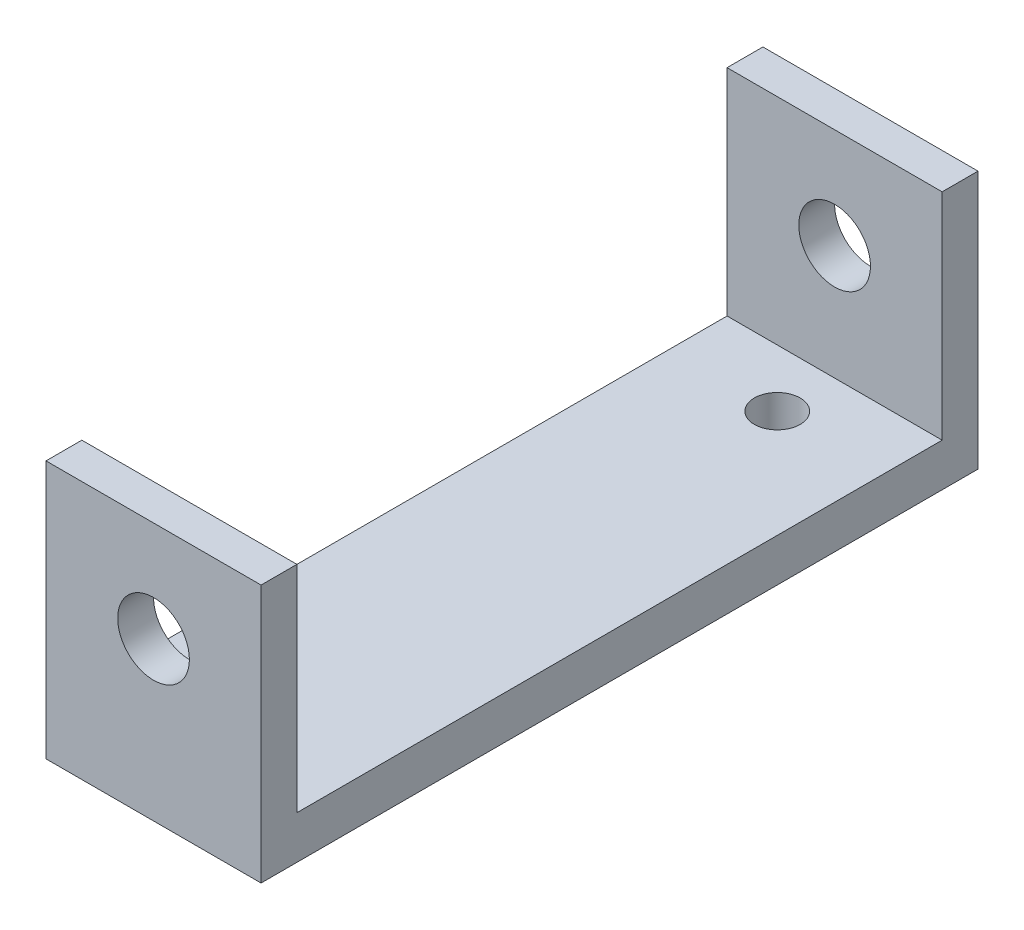
ISO-10303-21;
HEADER;
FILE_DESCRIPTION(('STEP AP214'),'2;1');
FILE_NAME('part.step','',(''),(''),'','','');
FILE_SCHEMA(('AUTOMOTIVE_DESIGN { 1 0 10303 214 1 1 1 1 }'));
ENDSEC;
DATA;
#1=APPLICATION_CONTEXT('core data for automotive mechanical design processes');
#2=APPLICATION_PROTOCOL_DEFINITION('international standard','automotive_design',2000,#1);
#3=PRODUCT_CONTEXT('',#1,'mechanical');
#4=PRODUCT('Part','Part','',(#3));
#5=PRODUCT_RELATED_PRODUCT_CATEGORY('part','',(#4));
#6=PRODUCT_DEFINITION_FORMATION('','',#4);
#7=PRODUCT_DEFINITION_CONTEXT('part definition',#1,'design');
#8=PRODUCT_DEFINITION('design','',#6,#7);
#9=PRODUCT_DEFINITION_SHAPE('','',#8);
#10=(LENGTH_UNIT() NAMED_UNIT(*) SI_UNIT(.MILLI.,.METRE.));
#11=(NAMED_UNIT(*) PLANE_ANGLE_UNIT() SI_UNIT($,.RADIAN.));
#12=(NAMED_UNIT(*) SI_UNIT($,.STERADIAN.) SOLID_ANGLE_UNIT());
#13=UNCERTAINTY_MEASURE_WITH_UNIT(LENGTH_MEASURE(1.E-05),#10,'distance_accuracy_value','');
#14=(GEOMETRIC_REPRESENTATION_CONTEXT(3) GLOBAL_UNCERTAINTY_ASSIGNED_CONTEXT((#13)) GLOBAL_UNIT_ASSIGNED_CONTEXT((#10,
#11,#12)) REPRESENTATION_CONTEXT('',''));
#15=CARTESIAN_POINT('',(0.,0.,0.));
#16=DIRECTION('',(0.,0.,1.));
#17=DIRECTION('',(1.,0.,0.));
#18=AXIS2_PLACEMENT_3D('',#15,#16,#17);
#19=CARTESIAN_POINT('',(-124.377940305885,32.2359859970464,50.));
#20=DIRECTION('',(0.,-1.,0.));
#21=DIRECTION('',(0.,0.,-1.));
#22=AXIS2_PLACEMENT_3D('',#19,#20,#21);
#23=PLANE('',#22);
#24=CARTESIAN_POINT('',(-116.877940305885,32.2359859970464,43.5));
#25=DIRECTION('',(0.,1.,0.));
#26=DIRECTION('',(0.,0.,1.));
#27=AXIS2_PLACEMENT_3D('',#24,#25,#26);
#28=CIRCLE('',#27,1.60000000000001);
#29=CARTESIAN_POINT('',(-116.877940305885,32.2359859970464,45.1));
#30=VERTEX_POINT('',#29);
#31=EDGE_CURVE('E154',#30,#30,#28,.T.);
#32=ORIENTED_EDGE('',*,*,#31,.F.);
#33=EDGE_LOOP('',(#32));
#34=FACE_BOUND('',#33,.T.);
#35=CARTESIAN_POINT('',(-116.877940305885,32.2359859970464,6.50000000000001));
#36=DIRECTION('',(0.,1.,0.));
#37=DIRECTION('',(0.,0.,-1.));
#38=AXIS2_PLACEMENT_3D('',#35,#36,#37);
#39=CIRCLE('',#38,1.60000000000001);
#40=CARTESIAN_POINT('',(-116.877940305885,32.2359859970464,8.10000000000001));
#41=VERTEX_POINT('',#40);
#42=EDGE_CURVE('E153',#41,#41,#39,.T.);
#43=ORIENTED_EDGE('',*,*,#42,.F.);
#44=EDGE_LOOP('',(#43));
#45=FACE_BOUND('',#44,.T.);
#46=DIRECTION('',(1.,0.,0.));
#47=VECTOR('',#46,1.);
#48=CARTESIAN_POINT('',(-109.377940305885,32.2359859970464,2.5));
#49=LINE('',#48,#47);
#50=CARTESIAN_POINT('',(-124.377940305885,32.2359859970464,2.5));
#51=VERTEX_POINT('',#50);
#52=CARTESIAN_POINT('',(-109.377940305885,32.2359859970464,2.5));
#53=VERTEX_POINT('',#52);
#54=EDGE_CURVE('E51',#51,#53,#49,.T.);
#55=ORIENTED_EDGE('',*,*,#54,.F.);
#56=DIRECTION('',(0.,0.,-1.));
#57=VECTOR('',#56,1.);
#58=CARTESIAN_POINT('',(-124.377940305885,32.2359859970464,50.));
#59=LINE('',#58,#57);
#60=CARTESIAN_POINT('',(-124.377940305885,32.2359859970464,47.5));
#61=VERTEX_POINT('',#60);
#62=EDGE_CURVE('E41',#61,#51,#59,.T.);
#63=ORIENTED_EDGE('',*,*,#62,.F.);
#64=DIRECTION('',(-1.,0.,0.));
#65=VECTOR('',#64,1.);
#66=CARTESIAN_POINT('',(-109.377940305885,32.2359859970464,47.5));
#67=LINE('',#66,#65);
#68=CARTESIAN_POINT('',(-109.377940305885,32.2359859970464,47.5));
#69=VERTEX_POINT('',#68);
#70=EDGE_CURVE('E133',#69,#61,#67,.T.);
#71=ORIENTED_EDGE('',*,*,#70,.F.);
#72=DIRECTION('',(0.,0.,-1.));
#73=VECTOR('',#72,1.);
#74=CARTESIAN_POINT('',(-109.377940305885,32.2359859970464,50.));
#75=LINE('',#74,#73);
#76=EDGE_CURVE('E11',#69,#53,#75,.T.);
#77=ORIENTED_EDGE('',*,*,#76,.T.);
#78=EDGE_LOOP('',(#55,#63,#71,#77));
#79=FACE_BOUND('',#78,.T.);
#80=ADVANCED_FACE('F32',(#34,#45,#79),#23,.F.);
#81=CARTESIAN_POINT('',(-109.377940305885,32.2359859970464,50.));
#82=DIRECTION('',(-1.,0.,0.));
#83=DIRECTION('',(0.,0.,1.));
#84=AXIS2_PLACEMENT_3D('',#81,#82,#83);
#85=PLANE('',#84);
#86=DIRECTION('',(0.,1.,0.));
#87=VECTOR('',#86,1.);
#88=CARTESIAN_POINT('',(-109.377940305885,32.2359859970464,0.));
#89=LINE('',#88,#87);
#90=CARTESIAN_POINT('',(-109.377940305885,29.2359859970464,0.));
#91=VERTEX_POINT('',#90);
#92=CARTESIAN_POINT('',(-109.377940305885,47.2359859970464,0.));
#93=VERTEX_POINT('',#92);
#94=EDGE_CURVE('E96',#91,#93,#89,.T.);
#95=ORIENTED_EDGE('',*,*,#94,.T.);
#96=DIRECTION('',(0.,0.,-1.));
#97=VECTOR('',#96,1.);
#98=CARTESIAN_POINT('',(-109.377940305885,47.2359859970464,0.));
#99=LINE('',#98,#97);
#100=CARTESIAN_POINT('',(-109.377940305885,47.2359859970464,2.5));
#101=VERTEX_POINT('',#100);
#102=EDGE_CURVE('E100',#101,#93,#99,.T.);
#103=ORIENTED_EDGE('',*,*,#102,.F.);
#104=DIRECTION('',(0.,-1.,0.));
#105=VECTOR('',#104,1.);
#106=CARTESIAN_POINT('',(-109.377940305885,47.2359859970464,2.5));
#107=LINE('',#106,#105);
#108=EDGE_CURVE('E127',#101,#53,#107,.T.);
#109=ORIENTED_EDGE('',*,*,#108,.T.);
#110=ORIENTED_EDGE('',*,*,#76,.F.);
#111=DIRECTION('',(0.,-1.,0.));
#112=VECTOR('',#111,1.);
#113=CARTESIAN_POINT('',(-109.377940305885,47.2359859970464,47.5));
#114=LINE('',#113,#112);
#115=CARTESIAN_POINT('',(-109.377940305885,47.2359859970464,47.5));
#116=VERTEX_POINT('',#115);
#117=EDGE_CURVE('E150',#116,#69,#114,.T.);
#118=ORIENTED_EDGE('',*,*,#117,.F.);
#119=DIRECTION('',(0.,0.,-1.));
#120=VECTOR('',#119,1.);
#121=CARTESIAN_POINT('',(-109.377940305885,47.2359859970464,50.));
#122=LINE('',#121,#120);
#123=CARTESIAN_POINT('',(-109.377940305885,47.2359859970464,50.));
#124=VERTEX_POINT('',#123);
#125=EDGE_CURVE('E134',#124,#116,#122,.T.);
#126=ORIENTED_EDGE('',*,*,#125,.F.);
#127=DIRECTION('',(0.,1.,0.));
#128=VECTOR('',#127,1.);
#129=CARTESIAN_POINT('',(-109.377940305885,32.2359859970464,50.));
#130=LINE('',#129,#128);
#131=CARTESIAN_POINT('',(-109.377940305885,29.2359859970464,50.));
#132=VERTEX_POINT('',#131);
#133=EDGE_CURVE('E160',#132,#124,#130,.T.);
#134=ORIENTED_EDGE('',*,*,#133,.F.);
#135=DIRECTION('',(0.,0.,-1.));
#136=VECTOR('',#135,1.);
#137=CARTESIAN_POINT('',(-109.377940305885,29.2359859970464,50.));
#138=LINE('',#137,#136);
#139=EDGE_CURVE('E103',#132,#91,#138,.T.);
#140=ORIENTED_EDGE('',*,*,#139,.T.);
#141=EDGE_LOOP('',(#95,#103,#109,#110,#118,#126,#134,#140));
#142=FACE_BOUND('',#141,.T.);
#143=ADVANCED_FACE('F34',(#142),#85,.F.);
#144=CARTESIAN_POINT('',(-124.377940305885,32.2359859970464,50.));
#145=DIRECTION('',(1.,0.,0.));
#146=DIRECTION('',(0.,0.,-1.));
#147=AXIS2_PLACEMENT_3D('',#144,#145,#146);
#148=PLANE('',#147);
#149=DIRECTION('',(0.,-1.,0.));
#150=VECTOR('',#149,1.);
#151=CARTESIAN_POINT('',(-124.377940305885,32.2359859970464,0.));
#152=LINE('',#151,#150);
#153=CARTESIAN_POINT('',(-124.377940305885,47.2359859970464,0.));
#154=VERTEX_POINT('',#153);
#155=CARTESIAN_POINT('',(-124.377940305885,29.2359859970464,0.));
#156=VERTEX_POINT('',#155);
#157=EDGE_CURVE('E106',#154,#156,#152,.T.);
#158=ORIENTED_EDGE('',*,*,#157,.T.);
#159=DIRECTION('',(0.,0.,-1.));
#160=VECTOR('',#159,1.);
#161=CARTESIAN_POINT('',(-124.377940305885,29.2359859970464,50.));
#162=LINE('',#161,#160);
#163=CARTESIAN_POINT('',(-124.377940305885,29.2359859970464,50.));
#164=VERTEX_POINT('',#163);
#165=EDGE_CURVE('E170',#164,#156,#162,.T.);
#166=ORIENTED_EDGE('',*,*,#165,.F.);
#167=DIRECTION('',(0.,-1.,0.));
#168=VECTOR('',#167,1.);
#169=CARTESIAN_POINT('',(-124.377940305885,32.2359859970464,50.));
#170=LINE('',#169,#168);
#171=CARTESIAN_POINT('',(-124.377940305885,47.2359859970464,50.));
#172=VERTEX_POINT('',#171);
#173=EDGE_CURVE('E162',#172,#164,#170,.T.);
#174=ORIENTED_EDGE('',*,*,#173,.F.);
#175=DIRECTION('',(0.,0.,1.));
#176=VECTOR('',#175,1.);
#177=CARTESIAN_POINT('',(-124.377940305885,47.2359859970464,50.));
#178=LINE('',#177,#176);
#179=CARTESIAN_POINT('',(-124.377940305885,47.2359859970464,47.5));
#180=VERTEX_POINT('',#179);
#181=EDGE_CURVE('E139',#180,#172,#178,.T.);
#182=ORIENTED_EDGE('',*,*,#181,.F.);
#183=DIRECTION('',(0.,-1.,0.));
#184=VECTOR('',#183,1.);
#185=CARTESIAN_POINT('',(-124.377940305885,47.2359859970464,47.5));
#186=LINE('',#185,#184);
#187=EDGE_CURVE('E145',#180,#61,#186,.T.);
#188=ORIENTED_EDGE('',*,*,#187,.T.);
#189=ORIENTED_EDGE('',*,*,#62,.T.);
#190=DIRECTION('',(0.,-1.,0.));
#191=VECTOR('',#190,1.);
#192=CARTESIAN_POINT('',(-124.377940305885,47.2359859970464,2.5));
#193=LINE('',#192,#191);
#194=CARTESIAN_POINT('',(-124.377940305885,47.2359859970464,2.5));
#195=VERTEX_POINT('',#194);
#196=EDGE_CURVE('E130',#195,#51,#193,.T.);
#197=ORIENTED_EDGE('',*,*,#196,.F.);
#198=DIRECTION('',(0.,0.,1.));
#199=VECTOR('',#198,1.);
#200=CARTESIAN_POINT('',(-124.377940305885,47.2359859970464,0.));
#201=LINE('',#200,#199);
#202=EDGE_CURVE('E114',#154,#195,#201,.T.);
#203=ORIENTED_EDGE('',*,*,#202,.F.);
#204=EDGE_LOOP('',(#158,#166,#174,#182,#188,#189,#197,#203));
#205=FACE_BOUND('',#204,.T.);
#206=ADVANCED_FACE('F201',(#205),#148,.F.);
#207=CARTESIAN_POINT('',(-124.377940305885,29.2359859970464,50.));
#208=DIRECTION('',(0.,1.,0.));
#209=DIRECTION('',(0.,0.,1.));
#210=AXIS2_PLACEMENT_3D('',#207,#208,#209);
#211=PLANE('',#210);
#212=CARTESIAN_POINT('',(-116.877940305885,29.2359859970464,43.5));
#213=DIRECTION('',(0.,1.,0.));
#214=DIRECTION('',(0.,0.,1.));
#215=AXIS2_PLACEMENT_3D('',#212,#213,#214);
#216=CIRCLE('',#215,1.60000000000001);
#217=CARTESIAN_POINT('',(-116.877940305885,29.2359859970464,45.1));
#218=VERTEX_POINT('',#217);
#219=EDGE_CURVE('E107',#218,#218,#216,.T.);
#220=ORIENTED_EDGE('',*,*,#219,.T.);
#221=EDGE_LOOP('',(#220));
#222=FACE_BOUND('',#221,.T.);
#223=CARTESIAN_POINT('',(-116.877940305885,29.2359859970464,6.50000000000001));
#224=DIRECTION('',(0.,1.,0.));
#225=DIRECTION('',(0.,0.,1.));
#226=AXIS2_PLACEMENT_3D('',#223,#224,#225);
#227=CIRCLE('',#226,1.60000000000001);
#228=CARTESIAN_POINT('',(-116.877940305885,29.2359859970464,8.10000000000001));
#229=VERTEX_POINT('',#228);
#230=EDGE_CURVE('E157',#229,#229,#227,.T.);
#231=ORIENTED_EDGE('',*,*,#230,.T.);
#232=EDGE_LOOP('',(#231));
#233=FACE_BOUND('',#232,.T.);
#234=DIRECTION('',(1.,0.,0.));
#235=VECTOR('',#234,1.);
#236=CARTESIAN_POINT('',(-124.377940305885,29.2359859970464,0.));
#237=LINE('',#236,#235);
#238=EDGE_CURVE('E163',#156,#91,#237,.T.);
#239=ORIENTED_EDGE('',*,*,#238,.T.);
#240=ORIENTED_EDGE('',*,*,#139,.F.);
#241=DIRECTION('',(1.,0.,0.));
#242=VECTOR('',#241,1.);
#243=CARTESIAN_POINT('',(-124.377940305885,29.2359859970464,50.));
#244=LINE('',#243,#242);
#245=EDGE_CURVE('E165',#164,#132,#244,.T.);
#246=ORIENTED_EDGE('',*,*,#245,.F.);
#247=ORIENTED_EDGE('',*,*,#165,.T.);
#248=EDGE_LOOP('',(#239,#240,#246,#247));
#249=FACE_BOUND('',#248,.T.);
#250=ADVANCED_FACE('F178',(#222,#233,#249),#211,.F.);
#251=CARTESIAN_POINT('',(0.,0.,50.));
#252=DIRECTION('',(0.,0.,1.));
#253=DIRECTION('',(1.,0.,0.));
#254=AXIS2_PLACEMENT_3D('',#251,#252,#253);
#255=PLANE('',#254);
#256=CARTESIAN_POINT('',(-116.877940305885,40.2359859970464,50.));
#257=DIRECTION('',(0.,0.,1.));
#258=DIRECTION('',(1.,0.,0.));
#259=AXIS2_PLACEMENT_3D('',#256,#257,#258);
#260=CIRCLE('',#259,2.5);
#261=CARTESIAN_POINT('',(-114.377940305885,40.2359859970464,50.));
#262=VERTEX_POINT('',#261);
#263=EDGE_CURVE('E221',#262,#262,#260,.T.);
#264=ORIENTED_EDGE('',*,*,#263,.F.);
#265=EDGE_LOOP('',(#264));
#266=FACE_BOUND('',#265,.T.);
#267=ORIENTED_EDGE('',*,*,#133,.T.);
#268=DIRECTION('',(1.,0.,0.));
#269=VECTOR('',#268,1.);
#270=CARTESIAN_POINT('',(-109.377940305885,47.2359859970464,50.));
#271=LINE('',#270,#269);
#272=EDGE_CURVE('E142',#172,#124,#271,.T.);
#273=ORIENTED_EDGE('',*,*,#272,.F.);
#274=ORIENTED_EDGE('',*,*,#173,.T.);
#275=ORIENTED_EDGE('',*,*,#245,.T.);
#276=EDGE_LOOP('',(#267,#273,#274,#275));
#277=FACE_BOUND('',#276,.T.);
#278=ADVANCED_FACE('F210',(#266,#277),#255,.T.);
#279=CARTESIAN_POINT('',(0.,0.,0.));
#280=DIRECTION('',(0.,0.,1.));
#281=DIRECTION('',(1.,0.,0.));
#282=AXIS2_PLACEMENT_3D('',#279,#280,#281);
#283=PLANE('',#282);
#284=CARTESIAN_POINT('',(-116.877940305885,40.2359859970464,0.));
#285=DIRECTION('',(0.,0.,1.));
#286=DIRECTION('',(1.,0.,0.));
#287=AXIS2_PLACEMENT_3D('',#284,#285,#286);
#288=CIRCLE('',#287,2.5);
#289=CARTESIAN_POINT('',(-114.377940305885,40.2359859970464,0.));
#290=VERTEX_POINT('',#289);
#291=EDGE_CURVE('E121',#290,#290,#288,.T.);
#292=ORIENTED_EDGE('',*,*,#291,.T.);
#293=EDGE_LOOP('',(#292));
#294=FACE_BOUND('',#293,.T.);
#295=ORIENTED_EDGE('',*,*,#94,.F.);
#296=ORIENTED_EDGE('',*,*,#238,.F.);
#297=ORIENTED_EDGE('',*,*,#157,.F.);
#298=DIRECTION('',(-1.,0.,0.));
#299=VECTOR('',#298,1.);
#300=CARTESIAN_POINT('',(-109.377940305885,47.2359859970464,0.));
#301=LINE('',#300,#299);
#302=EDGE_CURVE('E110',#93,#154,#301,.T.);
#303=ORIENTED_EDGE('',*,*,#302,.F.);
#304=EDGE_LOOP('',(#295,#296,#297,#303));
#305=FACE_BOUND('',#304,.T.);
#306=ADVANCED_FACE('F111',(#294,#305),#283,.F.);
#307=CARTESIAN_POINT('',(-116.877940305885,-12.7640140029536,6.50000000000001));
#308=DIRECTION('',(0.,1.,0.));
#309=DIRECTION('',(0.,0.,1.));
#310=AXIS2_PLACEMENT_3D('',#307,#308,#309);
#311=CYLINDRICAL_SURFACE('',#310,1.60000000000001);
#312=CARTESIAN_POINT('',(-116.877940305885,32.2359859970464,8.10000000000001));
#313=CARTESIAN_POINT('',(-116.877940305885,32.2047359970464,8.10000000000001));
#314=CARTESIAN_POINT('',(-116.877940305885,32.1734859970464,8.10000000000001));
#315=CARTESIAN_POINT('',(-116.877940305885,32.1109859970464,8.10000000000001));
#316=CARTESIAN_POINT('',(-116.877940305885,32.0797359970464,8.10000000000001));
#317=CARTESIAN_POINT('',(-116.877940305885,32.0172359970464,8.10000000000001));
#318=CARTESIAN_POINT('',(-116.877940305885,31.9859859970464,8.10000000000001));
#319=CARTESIAN_POINT('',(-116.877940305885,31.9234859970464,8.10000000000001));
#320=CARTESIAN_POINT('',(-116.877940305885,31.8922359970464,8.10000000000001));
#321=CARTESIAN_POINT('',(-116.877940305885,31.8297359970464,8.10000000000001));
#322=CARTESIAN_POINT('',(-116.877940305885,31.7984859970464,8.10000000000001));
#323=CARTESIAN_POINT('',(-116.877940305885,31.7359859970464,8.10000000000001));
#324=CARTESIAN_POINT('',(-116.877940305885,31.7047359970464,8.10000000000001));
#325=CARTESIAN_POINT('',(-116.877940305885,31.6422359970464,8.10000000000001));
#326=CARTESIAN_POINT('',(-116.877940305885,31.6109859970464,8.10000000000001));
#327=CARTESIAN_POINT('',(-116.877940305885,31.5484859970464,8.10000000000001));
#328=CARTESIAN_POINT('',(-116.877940305885,31.5172359970464,8.10000000000001));
#329=CARTESIAN_POINT('',(-116.877940305885,31.4547359970464,8.10000000000001));
#330=CARTESIAN_POINT('',(-116.877940305885,31.4234859970464,8.10000000000001));
#331=CARTESIAN_POINT('',(-116.877940305885,31.3609859970464,8.10000000000001));
#332=CARTESIAN_POINT('',(-116.877940305885,31.3297359970464,8.10000000000001));
#333=CARTESIAN_POINT('',(-116.877940305885,31.2672359970464,8.10000000000001));
#334=CARTESIAN_POINT('',(-116.877940305885,31.2359859970464,8.10000000000001));
#335=CARTESIAN_POINT('',(-116.877940305885,31.1734859970464,8.10000000000001));
#336=CARTESIAN_POINT('',(-116.877940305885,31.1422359970464,8.10000000000001));
#337=CARTESIAN_POINT('',(-116.877940305885,31.0797359970464,8.10000000000001));
#338=CARTESIAN_POINT('',(-116.877940305885,31.0484859970464,8.10000000000001));
#339=CARTESIAN_POINT('',(-116.877940305885,30.9859859970464,8.10000000000001));
#340=CARTESIAN_POINT('',(-116.877940305885,30.9547359970464,8.10000000000001));
#341=CARTESIAN_POINT('',(-116.877940305885,30.8922359970464,8.10000000000001));
#342=CARTESIAN_POINT('',(-116.877940305885,30.8609859970464,8.10000000000001));
#343=CARTESIAN_POINT('',(-116.877940305885,30.7984859970464,8.10000000000001));
#344=CARTESIAN_POINT('',(-116.877940305885,30.7672359970464,8.10000000000001));
#345=CARTESIAN_POINT('',(-116.877940305885,30.7047359970464,8.10000000000001));
#346=CARTESIAN_POINT('',(-116.877940305885,30.6734859970464,8.10000000000001));
#347=CARTESIAN_POINT('',(-116.877940305885,30.6109859970464,8.10000000000001));
#348=CARTESIAN_POINT('',(-116.877940305885,30.5797359970464,8.10000000000001));
#349=CARTESIAN_POINT('',(-116.877940305885,30.5172359970464,8.10000000000001));
#350=CARTESIAN_POINT('',(-116.877940305885,30.4859859970464,8.10000000000001));
#351=CARTESIAN_POINT('',(-116.877940305885,30.4234859970464,8.10000000000001));
#352=CARTESIAN_POINT('',(-116.877940305885,30.3922359970464,8.10000000000001));
#353=CARTESIAN_POINT('',(-116.877940305885,30.3297359970464,8.10000000000001));
#354=CARTESIAN_POINT('',(-116.877940305885,30.2984859970464,8.10000000000001));
#355=CARTESIAN_POINT('',(-116.877940305885,30.2359859970464,8.10000000000001));
#356=CARTESIAN_POINT('',(-116.877940305885,30.2047359970464,8.10000000000001));
#357=CARTESIAN_POINT('',(-116.877940305885,30.1422359970464,8.10000000000001));
#358=CARTESIAN_POINT('',(-116.877940305885,30.1109859970464,8.10000000000001));
#359=CARTESIAN_POINT('',(-116.877940305885,30.0484859970464,8.10000000000001));
#360=CARTESIAN_POINT('',(-116.877940305885,30.0172359970464,8.10000000000001));
#361=CARTESIAN_POINT('',(-116.877940305885,29.9547359970464,8.10000000000001));
#362=CARTESIAN_POINT('',(-116.877940305885,29.9234859970464,8.10000000000001));
#363=CARTESIAN_POINT('',(-116.877940305885,29.8609859970464,8.10000000000001));
#364=CARTESIAN_POINT('',(-116.877940305885,29.8297359970464,8.10000000000001));
#365=CARTESIAN_POINT('',(-116.877940305885,29.7672359970464,8.10000000000001));
#366=CARTESIAN_POINT('',(-116.877940305885,29.7359859970464,8.10000000000001));
#367=CARTESIAN_POINT('',(-116.877940305885,29.6734859970464,8.10000000000001));
#368=CARTESIAN_POINT('',(-116.877940305885,29.6422359970464,8.10000000000001));
#369=CARTESIAN_POINT('',(-116.877940305885,29.5797359970464,8.10000000000001));
#370=CARTESIAN_POINT('',(-116.877940305885,29.5484859970464,8.10000000000001));
#371=CARTESIAN_POINT('',(-116.877940305885,29.4859859970464,8.10000000000001));
#372=CARTESIAN_POINT('',(-116.877940305885,29.4547359970464,8.10000000000001));
#373=CARTESIAN_POINT('',(-116.877940305885,29.3922359970464,8.10000000000001));
#374=CARTESIAN_POINT('',(-116.877940305885,29.3609859970464,8.10000000000001));
#375=CARTESIAN_POINT('',(-116.877940305885,29.2984859970464,8.10000000000001));
#376=CARTESIAN_POINT('',(-116.877940305885,29.2672359970464,8.10000000000001));
#377=CARTESIAN_POINT('',(-116.877940305885,29.2359859970464,8.10000000000001));
#378=B_SPLINE_CURVE_WITH_KNOTS('',3,(#312,#313,#314,#315,#316,#317,#318,#319,#320,#321,#322,
#323,#324,#325,#326,#327,#328,#329,#330,#331,#332,#333,#334,#335,#336,#337,#338,#339,#340,#341,
#342,#343,#344,#345,#346,#347,#348,#349,#350,#351,#352,#353,#354,#355,#356,#357,#358,#359,#360,
#361,#362,#363,#364,#365,#366,#367,#368,#369,#370,#371,#372,#373,#374,#375,#376,#377),
.UNSPECIFIED.,.F.,.F.,(4,2,2,2,2,2,2,2,2,2,2,2,2,2,2,2,2,2,2,2,2,2,2,2,2,2,2,2,2,2,2,2,4),(0.,
0.0937500000000036,0.1875,0.281249999999997,0.375,0.468750000000004,0.5625,0.656249999999997,
0.750000000000001,0.843750000000004,0.937500000000001,1.03125,1.125,1.21875,1.3125,1.40625,1.5,
1.59375,1.6875,1.78125,1.875,1.96875000000001,2.0625,2.15625,2.25,2.34375000000001,2.4375,
2.53125,2.625,2.71875000000001,2.8125,2.90625,3.),.UNSPECIFIED.);
#379=EDGE_CURVE('BSEAM184',#41,#229,#378,.T.);
#380=ORIENTED_EDGE('',*,*,#42,.T.);
#381=ORIENTED_EDGE('',*,*,#230,.F.);
#382=ORIENTED_EDGE('',*,*,#379,.T.);
#383=ORIENTED_EDGE('',*,*,#379,.F.);
#384=EDGE_LOOP('',(#380,#382,#381,#383));
#385=FACE_BOUND('',#384,.T.);
#386=ADVANCED_FACE('F184',(#385),#311,.F.);
#387=CARTESIAN_POINT('',(-116.877940305885,-12.7640140029536,43.5));
#388=DIRECTION('',(0.,1.,0.));
#389=DIRECTION('',(0.,0.,1.));
#390=AXIS2_PLACEMENT_3D('',#387,#388,#389);
#391=CYLINDRICAL_SURFACE('',#390,1.60000000000001);
#392=CARTESIAN_POINT('',(-116.877940305885,32.2359859970464,45.1));
#393=CARTESIAN_POINT('',(-116.877940305885,32.2047359970464,45.1));
#394=CARTESIAN_POINT('',(-116.877940305885,32.1734859970464,45.1));
#395=CARTESIAN_POINT('',(-116.877940305885,32.1109859970464,45.1));
#396=CARTESIAN_POINT('',(-116.877940305885,32.0797359970464,45.1));
#397=CARTESIAN_POINT('',(-116.877940305885,32.0172359970464,45.1));
#398=CARTESIAN_POINT('',(-116.877940305885,31.9859859970464,45.1));
#399=CARTESIAN_POINT('',(-116.877940305885,31.9234859970464,45.1));
#400=CARTESIAN_POINT('',(-116.877940305885,31.8922359970464,45.1));
#401=CARTESIAN_POINT('',(-116.877940305885,31.8297359970464,45.1));
#402=CARTESIAN_POINT('',(-116.877940305885,31.7984859970464,45.1));
#403=CARTESIAN_POINT('',(-116.877940305885,31.7359859970464,45.1));
#404=CARTESIAN_POINT('',(-116.877940305885,31.7047359970464,45.1));
#405=CARTESIAN_POINT('',(-116.877940305885,31.6422359970464,45.1));
#406=CARTESIAN_POINT('',(-116.877940305885,31.6109859970464,45.1));
#407=CARTESIAN_POINT('',(-116.877940305885,31.5484859970464,45.1));
#408=CARTESIAN_POINT('',(-116.877940305885,31.5172359970464,45.1));
#409=CARTESIAN_POINT('',(-116.877940305885,31.4547359970464,45.1));
#410=CARTESIAN_POINT('',(-116.877940305885,31.4234859970464,45.1));
#411=CARTESIAN_POINT('',(-116.877940305885,31.3609859970464,45.1));
#412=CARTESIAN_POINT('',(-116.877940305885,31.3297359970464,45.1));
#413=CARTESIAN_POINT('',(-116.877940305885,31.2672359970464,45.1));
#414=CARTESIAN_POINT('',(-116.877940305885,31.2359859970464,45.1));
#415=CARTESIAN_POINT('',(-116.877940305885,31.1734859970464,45.1));
#416=CARTESIAN_POINT('',(-116.877940305885,31.1422359970464,45.1));
#417=CARTESIAN_POINT('',(-116.877940305885,31.0797359970464,45.1));
#418=CARTESIAN_POINT('',(-116.877940305885,31.0484859970464,45.1));
#419=CARTESIAN_POINT('',(-116.877940305885,30.9859859970464,45.1));
#420=CARTESIAN_POINT('',(-116.877940305885,30.9547359970464,45.1));
#421=CARTESIAN_POINT('',(-116.877940305885,30.8922359970464,45.1));
#422=CARTESIAN_POINT('',(-116.877940305885,30.8609859970464,45.1));
#423=CARTESIAN_POINT('',(-116.877940305885,30.7984859970464,45.1));
#424=CARTESIAN_POINT('',(-116.877940305885,30.7672359970464,45.1));
#425=CARTESIAN_POINT('',(-116.877940305885,30.7047359970464,45.1));
#426=CARTESIAN_POINT('',(-116.877940305885,30.6734859970464,45.1));
#427=CARTESIAN_POINT('',(-116.877940305885,30.6109859970464,45.1));
#428=CARTESIAN_POINT('',(-116.877940305885,30.5797359970464,45.1));
#429=CARTESIAN_POINT('',(-116.877940305885,30.5172359970464,45.1));
#430=CARTESIAN_POINT('',(-116.877940305885,30.4859859970464,45.1));
#431=CARTESIAN_POINT('',(-116.877940305885,30.4234859970464,45.1));
#432=CARTESIAN_POINT('',(-116.877940305885,30.3922359970464,45.1));
#433=CARTESIAN_POINT('',(-116.877940305885,30.3297359970464,45.1));
#434=CARTESIAN_POINT('',(-116.877940305885,30.2984859970464,45.1));
#435=CARTESIAN_POINT('',(-116.877940305885,30.2359859970464,45.1));
#436=CARTESIAN_POINT('',(-116.877940305885,30.2047359970464,45.1));
#437=CARTESIAN_POINT('',(-116.877940305885,30.1422359970464,45.1));
#438=CARTESIAN_POINT('',(-116.877940305885,30.1109859970464,45.1));
#439=CARTESIAN_POINT('',(-116.877940305885,30.0484859970464,45.1));
#440=CARTESIAN_POINT('',(-116.877940305885,30.0172359970464,45.1));
#441=CARTESIAN_POINT('',(-116.877940305885,29.9547359970464,45.1));
#442=CARTESIAN_POINT('',(-116.877940305885,29.9234859970464,45.1));
#443=CARTESIAN_POINT('',(-116.877940305885,29.8609859970464,45.1));
#444=CARTESIAN_POINT('',(-116.877940305885,29.8297359970464,45.1));
#445=CARTESIAN_POINT('',(-116.877940305885,29.7672359970464,45.1));
#446=CARTESIAN_POINT('',(-116.877940305885,29.7359859970464,45.1));
#447=CARTESIAN_POINT('',(-116.877940305885,29.6734859970464,45.1));
#448=CARTESIAN_POINT('',(-116.877940305885,29.6422359970464,45.1));
#449=CARTESIAN_POINT('',(-116.877940305885,29.5797359970464,45.1));
#450=CARTESIAN_POINT('',(-116.877940305885,29.5484859970464,45.1));
#451=CARTESIAN_POINT('',(-116.877940305885,29.4859859970464,45.1));
#452=CARTESIAN_POINT('',(-116.877940305885,29.4547359970464,45.1));
#453=CARTESIAN_POINT('',(-116.877940305885,29.3922359970464,45.1));
#454=CARTESIAN_POINT('',(-116.877940305885,29.3609859970464,45.1));
#455=CARTESIAN_POINT('',(-116.877940305885,29.2984859970464,45.1));
#456=CARTESIAN_POINT('',(-116.877940305885,29.2672359970464,45.1));
#457=CARTESIAN_POINT('',(-116.877940305885,29.2359859970464,45.1));
#458=B_SPLINE_CURVE_WITH_KNOTS('',3,(#392,#393,#394,#395,#396,#397,#398,#399,#400,#401,#402,
#403,#404,#405,#406,#407,#408,#409,#410,#411,#412,#413,#414,#415,#416,#417,#418,#419,#420,#421,
#422,#423,#424,#425,#426,#427,#428,#429,#430,#431,#432,#433,#434,#435,#436,#437,#438,#439,#440,
#441,#442,#443,#444,#445,#446,#447,#448,#449,#450,#451,#452,#453,#454,#455,#456,#457),
.UNSPECIFIED.,.F.,.F.,(4,2,2,2,2,2,2,2,2,2,2,2,2,2,2,2,2,2,2,2,2,2,2,2,2,2,2,2,2,2,2,2,4),(0.,
0.0937500000000036,0.1875,0.281249999999997,0.375,0.468750000000004,0.5625,0.656249999999997,
0.750000000000001,0.843750000000004,0.937500000000001,1.03125,1.125,1.21875,1.3125,1.40625,1.5,
1.59375,1.6875,1.78125,1.875,1.96875000000001,2.0625,2.15625,2.25,2.34375000000001,2.4375,
2.53125,2.625,2.71875000000001,2.8125,2.90625,3.),.UNSPECIFIED.);
#459=EDGE_CURVE('BSEAM181',#30,#218,#458,.T.);
#460=ORIENTED_EDGE('',*,*,#31,.T.);
#461=ORIENTED_EDGE('',*,*,#219,.F.);
#462=ORIENTED_EDGE('',*,*,#459,.T.);
#463=ORIENTED_EDGE('',*,*,#459,.F.);
#464=EDGE_LOOP('',(#460,#462,#461,#463));
#465=FACE_BOUND('',#464,.T.);
#466=ADVANCED_FACE('F181',(#465),#391,.F.);
#467=CARTESIAN_POINT('',(-109.377940305885,47.2359859970464,47.5));
#468=DIRECTION('',(0.,0.,1.));
#469=DIRECTION('',(1.,0.,0.));
#470=AXIS2_PLACEMENT_3D('',#467,#468,#469);
#471=PLANE('',#470);
#472=CARTESIAN_POINT('',(-116.877940305885,40.2359859970464,47.5));
#473=DIRECTION('',(0.,0.,1.));
#474=DIRECTION('',(1.,0.,0.));
#475=AXIS2_PLACEMENT_3D('',#472,#473,#474);
#476=CIRCLE('',#475,2.5);
#477=CARTESIAN_POINT('',(-114.377940305885,40.2359859970464,47.5));
#478=VERTEX_POINT('',#477);
#479=EDGE_CURVE('E258',#478,#478,#476,.T.);
#480=ORIENTED_EDGE('',*,*,#479,.T.);
#481=EDGE_LOOP('',(#480));
#482=FACE_BOUND('',#481,.T.);
#483=ORIENTED_EDGE('',*,*,#70,.T.);
#484=ORIENTED_EDGE('',*,*,#187,.F.);
#485=DIRECTION('',(-1.,0.,0.));
#486=VECTOR('',#485,1.);
#487=CARTESIAN_POINT('',(-109.377940305885,47.2359859970464,47.5));
#488=LINE('',#487,#486);
#489=EDGE_CURVE('E137',#116,#180,#488,.T.);
#490=ORIENTED_EDGE('',*,*,#489,.F.);
#491=ORIENTED_EDGE('',*,*,#117,.T.);
#492=EDGE_LOOP('',(#483,#484,#490,#491));
#493=FACE_BOUND('',#492,.T.);
#494=ADVANCED_FACE('F183',(#482,#493),#471,.F.);
#495=CARTESIAN_POINT('',(0.,47.2359859970464,0.));
#496=DIRECTION('',(0.,1.,0.));
#497=DIRECTION('',(0.,0.,1.));
#498=AXIS2_PLACEMENT_3D('',#495,#496,#497);
#499=PLANE('',#498);
#500=ORIENTED_EDGE('',*,*,#125,.T.);
#501=ORIENTED_EDGE('',*,*,#489,.T.);
#502=ORIENTED_EDGE('',*,*,#181,.T.);
#503=ORIENTED_EDGE('',*,*,#272,.T.);
#504=EDGE_LOOP('',(#500,#501,#502,#503));
#505=FACE_BOUND('',#504,.T.);
#506=ADVANCED_FACE('F191',(#505),#499,.T.);
#507=CARTESIAN_POINT('',(-109.377940305885,47.2359859970464,2.5));
#508=DIRECTION('',(0.,0.,-1.));
#509=DIRECTION('',(-1.,0.,0.));
#510=AXIS2_PLACEMENT_3D('',#507,#508,#509);
#511=PLANE('',#510);
#512=CARTESIAN_POINT('',(-116.877940305885,40.2359859970464,2.5));
#513=DIRECTION('',(0.,0.,-1.));
#514=DIRECTION('',(-1.,0.,0.));
#515=AXIS2_PLACEMENT_3D('',#512,#513,#514);
#516=CIRCLE('',#515,2.5);
#517=CARTESIAN_POINT('',(-119.377940305885,40.2359859970464,2.5));
#518=VERTEX_POINT('',#517);
#519=EDGE_CURVE('E36',#518,#518,#516,.T.);
#520=ORIENTED_EDGE('',*,*,#519,.T.);
#521=EDGE_LOOP('',(#520));
#522=FACE_BOUND('',#521,.T.);
#523=ORIENTED_EDGE('',*,*,#54,.T.);
#524=ORIENTED_EDGE('',*,*,#108,.F.);
#525=DIRECTION('',(1.,0.,0.));
#526=VECTOR('',#525,1.);
#527=CARTESIAN_POINT('',(-109.377940305885,47.2359859970464,2.5));
#528=LINE('',#527,#526);
#529=EDGE_CURVE('E118',#195,#101,#528,.T.);
#530=ORIENTED_EDGE('',*,*,#529,.F.);
#531=ORIENTED_EDGE('',*,*,#196,.T.);
#532=EDGE_LOOP('',(#523,#524,#530,#531));
#533=FACE_BOUND('',#532,.T.);
#534=ADVANCED_FACE('F234',(#522,#533),#511,.F.);
#535=CARTESIAN_POINT('',(0.,47.2359859970464,0.));
#536=DIRECTION('',(0.,-1.,0.));
#537=DIRECTION('',(0.,0.,-1.));
#538=AXIS2_PLACEMENT_3D('',#535,#536,#537);
#539=PLANE('',#538);
#540=ORIENTED_EDGE('',*,*,#102,.T.);
#541=ORIENTED_EDGE('',*,*,#302,.T.);
#542=ORIENTED_EDGE('',*,*,#202,.T.);
#543=ORIENTED_EDGE('',*,*,#529,.T.);
#544=EDGE_LOOP('',(#540,#541,#542,#543));
#545=FACE_BOUND('',#544,.T.);
#546=ADVANCED_FACE('F116',(#545),#539,.F.);
#547=CARTESIAN_POINT('',(-116.877940305885,40.2359859970464,-15.));
#548=DIRECTION('',(0.,0.,1.));
#549=DIRECTION('',(1.,0.,0.));
#550=AXIS2_PLACEMENT_3D('',#547,#548,#549);
#551=CYLINDRICAL_SURFACE('',#550,2.5);
#552=ORIENTED_EDGE('',*,*,#519,.F.);
#553=EDGE_LOOP('',(#552));
#554=FACE_BOUND('',#553,.T.);
#555=ORIENTED_EDGE('',*,*,#291,.F.);
#556=EDGE_LOOP('',(#555));
#557=FACE_BOUND('',#556,.T.);
#558=ADVANCED_FACE('F242',(#554,#557),#551,.F.);
#559=ORIENTED_EDGE('',*,*,#263,.T.);
#560=EDGE_LOOP('',(#559));
#561=FACE_BOUND('',#560,.T.);
#562=ORIENTED_EDGE('',*,*,#479,.F.);
#563=EDGE_LOOP('',(#562));
#564=FACE_BOUND('',#563,.T.);
#565=ADVANCED_FACE('F248',(#561,#564),#551,.F.);
#566=CLOSED_SHELL('',(#80,#143,#206,#250,#278,#306,#386,#466,#494,#506,#534,#546,#558,#565));
#567=MANIFOLD_SOLID_BREP('B2',#566);
#568=ADVANCED_BREP_SHAPE_REPRESENTATION('',(#18,#567),#14);
#569=SHAPE_DEFINITION_REPRESENTATION(#9,#568);
ENDSEC;
END-ISO-10303-21;
